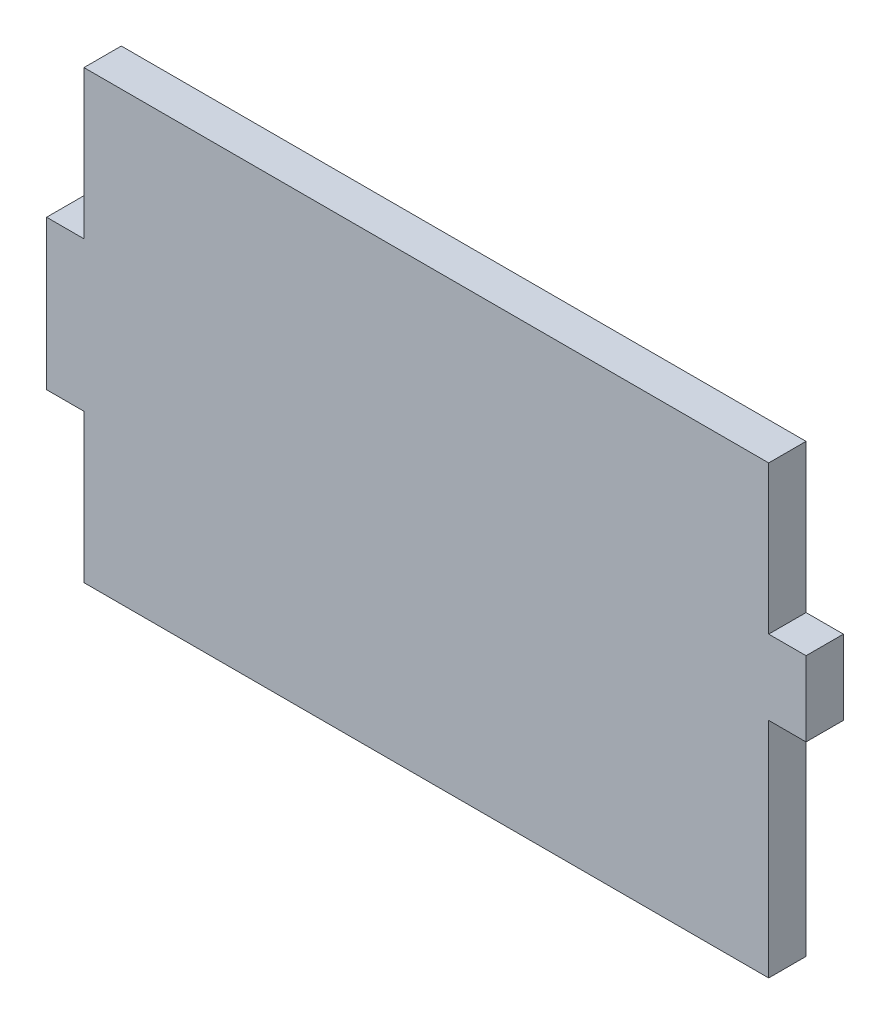
ISO-10303-21;
HEADER;
FILE_DESCRIPTION(('STEP AP214'),'2;1');
FILE_NAME('part.step','',(''),(''),'','','');
FILE_SCHEMA(('AUTOMOTIVE_DESIGN { 1 0 10303 214 1 1 1 1 }'));
ENDSEC;
DATA;
#1=APPLICATION_CONTEXT('core data for automotive mechanical design processes');
#2=APPLICATION_PROTOCOL_DEFINITION('international standard','automotive_design',2000,#1);
#3=PRODUCT_CONTEXT('',#1,'mechanical');
#4=PRODUCT('Part','Part','',(#3));
#5=PRODUCT_RELATED_PRODUCT_CATEGORY('part','',(#4));
#6=PRODUCT_DEFINITION_FORMATION('','',#4);
#7=PRODUCT_DEFINITION_CONTEXT('part definition',#1,'design');
#8=PRODUCT_DEFINITION('design','',#6,#7);
#9=PRODUCT_DEFINITION_SHAPE('','',#8);
#10=(LENGTH_UNIT() NAMED_UNIT(*) SI_UNIT(.MILLI.,.METRE.));
#11=(NAMED_UNIT(*) PLANE_ANGLE_UNIT() SI_UNIT($,.RADIAN.));
#12=(NAMED_UNIT(*) SI_UNIT($,.STERADIAN.) SOLID_ANGLE_UNIT());
#13=UNCERTAINTY_MEASURE_WITH_UNIT(LENGTH_MEASURE(1.E-05),#10,'distance_accuracy_value','');
#14=(GEOMETRIC_REPRESENTATION_CONTEXT(3) GLOBAL_UNCERTAINTY_ASSIGNED_CONTEXT((#13)) GLOBAL_UNIT_ASSIGNED_CONTEXT((#10,
#11,#12)) REPRESENTATION_CONTEXT('',''));
#15=CARTESIAN_POINT('',(0.,0.,0.));
#16=DIRECTION('',(0.,0.,1.));
#17=DIRECTION('',(1.,0.,0.));
#18=AXIS2_PLACEMENT_3D('',#15,#16,#17);
#19=CARTESIAN_POINT('',(0.,0.,3.));
#20=DIRECTION('',(1.,0.,0.));
#21=DIRECTION('',(0.,1.,0.));
#22=AXIS2_PLACEMENT_3D('',#19,#20,#21);
#23=PLANE('',#22);
#24=DIRECTION('',(0.,-1.,0.));
#25=VECTOR('',#24,1.);
#26=CARTESIAN_POINT('',(0.,0.,0.));
#27=LINE('',#26,#25);
#28=CARTESIAN_POINT('',(0.,0.,0.));
#29=VERTEX_POINT('',#28);
#30=CARTESIAN_POINT('',(0.,-11.91,0.));
#31=VERTEX_POINT('',#30);
#32=EDGE_CURVE('E159',#29,#31,#27,.T.);
#33=ORIENTED_EDGE('',*,*,#32,.T.);
#34=DIRECTION('',(0.,0.,-1.));
#35=VECTOR('',#34,1.);
#36=CARTESIAN_POINT('',(0.,-11.91,3.));
#37=LINE('',#36,#35);
#38=CARTESIAN_POINT('',(0.,-11.91,3.));
#39=VERTEX_POINT('',#38);
#40=EDGE_CURVE('E11',#39,#31,#37,.T.);
#41=ORIENTED_EDGE('',*,*,#40,.F.);
#42=DIRECTION('',(0.,-1.,0.));
#43=VECTOR('',#42,1.);
#44=CARTESIAN_POINT('',(0.,0.,3.));
#45=LINE('',#44,#43);
#46=CARTESIAN_POINT('',(0.,0.,3.));
#47=VERTEX_POINT('',#46);
#48=EDGE_CURVE('E181',#47,#39,#45,.T.);
#49=ORIENTED_EDGE('',*,*,#48,.F.);
#50=DIRECTION('',(0.,0.,-1.));
#51=VECTOR('',#50,1.);
#52=CARTESIAN_POINT('',(0.,0.,3.));
#53=LINE('',#52,#51);
#54=EDGE_CURVE('E155',#47,#29,#53,.T.);
#55=ORIENTED_EDGE('',*,*,#54,.T.);
#56=EDGE_LOOP('',(#33,#41,#49,#55));
#57=FACE_BOUND('',#56,.T.);
#58=ADVANCED_FACE('F39',(#57),#23,.F.);
#59=CARTESIAN_POINT('',(0.,-11.91,3.));
#60=DIRECTION('',(0.,-1.,0.));
#61=DIRECTION('',(0.,0.,-1.));
#62=AXIS2_PLACEMENT_3D('',#59,#60,#61);
#63=PLANE('',#62);
#64=DIRECTION('',(-1.,0.,0.));
#65=VECTOR('',#64,1.);
#66=CARTESIAN_POINT('',(0.,-11.91,0.));
#67=LINE('',#66,#65);
#68=CARTESIAN_POINT('',(-2.99999999999999,-11.91,0.));
#69=VERTEX_POINT('',#68);
#70=EDGE_CURVE('E162',#31,#69,#67,.T.);
#71=ORIENTED_EDGE('',*,*,#70,.T.);
#72=DIRECTION('',(0.,0.,-1.));
#73=VECTOR('',#72,1.);
#74=CARTESIAN_POINT('',(-2.99999999999999,-11.91,3.));
#75=LINE('',#74,#73);
#76=CARTESIAN_POINT('',(-2.99999999999999,-11.91,3.));
#77=VERTEX_POINT('',#76);
#78=EDGE_CURVE('E47',#77,#69,#75,.T.);
#79=ORIENTED_EDGE('',*,*,#78,.F.);
#80=DIRECTION('',(-1.,0.,0.));
#81=VECTOR('',#80,1.);
#82=CARTESIAN_POINT('',(0.,-11.91,3.));
#83=LINE('',#82,#81);
#84=EDGE_CURVE('E110',#39,#77,#83,.T.);
#85=ORIENTED_EDGE('',*,*,#84,.F.);
#86=ORIENTED_EDGE('',*,*,#40,.T.);
#87=EDGE_LOOP('',(#71,#79,#85,#86));
#88=FACE_BOUND('',#87,.T.);
#89=ADVANCED_FACE('F259',(#88),#63,.F.);
#90=CARTESIAN_POINT('',(-2.99999999999999,-11.91,3.));
#91=DIRECTION('',(1.,0.,0.));
#92=DIRECTION('',(0.,1.,0.));
#93=AXIS2_PLACEMENT_3D('',#90,#91,#92);
#94=PLANE('',#93);
#95=DIRECTION('',(0.,-1.,0.));
#96=VECTOR('',#95,1.);
#97=CARTESIAN_POINT('',(-2.99999999999999,-11.91,0.));
#98=LINE('',#97,#96);
#99=CARTESIAN_POINT('',(-2.99999999999999,-23.91,0.));
#100=VERTEX_POINT('',#99);
#101=EDGE_CURVE('E164',#69,#100,#98,.T.);
#102=ORIENTED_EDGE('',*,*,#101,.T.);
#103=DIRECTION('',(0.,0.,-1.));
#104=VECTOR('',#103,1.);
#105=CARTESIAN_POINT('',(-2.99999999999999,-23.91,3.));
#106=LINE('',#105,#104);
#107=CARTESIAN_POINT('',(-2.99999999999999,-23.91,3.));
#108=VERTEX_POINT('',#107);
#109=EDGE_CURVE('E200',#108,#100,#106,.T.);
#110=ORIENTED_EDGE('',*,*,#109,.F.);
#111=DIRECTION('',(0.,-1.,0.));
#112=VECTOR('',#111,1.);
#113=CARTESIAN_POINT('',(-2.99999999999999,-11.91,3.));
#114=LINE('',#113,#112);
#115=EDGE_CURVE('E208',#77,#108,#114,.T.);
#116=ORIENTED_EDGE('',*,*,#115,.F.);
#117=ORIENTED_EDGE('',*,*,#78,.T.);
#118=EDGE_LOOP('',(#102,#110,#116,#117));
#119=FACE_BOUND('',#118,.T.);
#120=ADVANCED_FACE('F206',(#119),#94,.F.);
#121=CARTESIAN_POINT('',(0.,-23.91,3.));
#122=DIRECTION('',(0.,1.,0.));
#123=DIRECTION('',(0.,0.,1.));
#124=AXIS2_PLACEMENT_3D('',#121,#122,#123);
#125=PLANE('',#124);
#126=DIRECTION('',(1.,0.,0.));
#127=VECTOR('',#126,1.);
#128=CARTESIAN_POINT('',(0.,-23.91,0.));
#129=LINE('',#128,#127);
#130=CARTESIAN_POINT('',(0.,-23.91,0.));
#131=VERTEX_POINT('',#130);
#132=EDGE_CURVE('E166',#100,#131,#129,.T.);
#133=ORIENTED_EDGE('',*,*,#132,.T.);
#134=DIRECTION('',(0.,0.,-1.));
#135=VECTOR('',#134,1.);
#136=CARTESIAN_POINT('',(0.,-23.91,3.));
#137=LINE('',#136,#135);
#138=CARTESIAN_POINT('',(0.,-23.91,3.));
#139=VERTEX_POINT('',#138);
#140=EDGE_CURVE('E197',#139,#131,#137,.T.);
#141=ORIENTED_EDGE('',*,*,#140,.F.);
#142=DIRECTION('',(1.,0.,0.));
#143=VECTOR('',#142,1.);
#144=CARTESIAN_POINT('',(0.,-23.91,3.));
#145=LINE('',#144,#143);
#146=EDGE_CURVE('E226',#108,#139,#145,.T.);
#147=ORIENTED_EDGE('',*,*,#146,.F.);
#148=ORIENTED_EDGE('',*,*,#109,.T.);
#149=EDGE_LOOP('',(#133,#141,#147,#148));
#150=FACE_BOUND('',#149,.T.);
#151=ADVANCED_FACE('F217',(#150),#125,.F.);
#152=CARTESIAN_POINT('',(0.,-23.91,3.));
#153=DIRECTION('',(1.,0.,0.));
#154=DIRECTION('',(0.,1.,0.));
#155=AXIS2_PLACEMENT_3D('',#152,#153,#154);
#156=PLANE('',#155);
#157=DIRECTION('',(0.,-1.,0.));
#158=VECTOR('',#157,1.);
#159=CARTESIAN_POINT('',(0.,-23.91,0.));
#160=LINE('',#159,#158);
#161=CARTESIAN_POINT('',(0.,-35.83,0.));
#162=VERTEX_POINT('',#161);
#163=EDGE_CURVE('E168',#131,#162,#160,.T.);
#164=ORIENTED_EDGE('',*,*,#163,.T.);
#165=DIRECTION('',(0.,0.,-1.));
#166=VECTOR('',#165,1.);
#167=CARTESIAN_POINT('',(0.,-35.83,3.));
#168=LINE('',#167,#166);
#169=CARTESIAN_POINT('',(0.,-35.83,3.));
#170=VERTEX_POINT('',#169);
#171=EDGE_CURVE('E194',#170,#162,#168,.T.);
#172=ORIENTED_EDGE('',*,*,#171,.F.);
#173=DIRECTION('',(0.,-1.,0.));
#174=VECTOR('',#173,1.);
#175=CARTESIAN_POINT('',(0.,-23.91,3.));
#176=LINE('',#175,#174);
#177=EDGE_CURVE('E223',#139,#170,#176,.T.);
#178=ORIENTED_EDGE('',*,*,#177,.F.);
#179=ORIENTED_EDGE('',*,*,#140,.T.);
#180=EDGE_LOOP('',(#164,#172,#178,#179));
#181=FACE_BOUND('',#180,.T.);
#182=ADVANCED_FACE('F221',(#181),#156,.F.);
#183=CARTESIAN_POINT('',(0.,-35.83,3.));
#184=DIRECTION('',(0.,1.,0.));
#185=DIRECTION('',(0.,0.,1.));
#186=AXIS2_PLACEMENT_3D('',#183,#184,#185);
#187=PLANE('',#186);
#188=DIRECTION('',(1.,0.,0.));
#189=VECTOR('',#188,1.);
#190=CARTESIAN_POINT('',(0.,-35.83,0.));
#191=LINE('',#190,#189);
#192=CARTESIAN_POINT('',(55.,-35.83,0.));
#193=VERTEX_POINT('',#192);
#194=EDGE_CURVE('E170',#162,#193,#191,.T.);
#195=ORIENTED_EDGE('',*,*,#194,.T.);
#196=DIRECTION('',(0.,0.,-1.));
#197=VECTOR('',#196,1.);
#198=CARTESIAN_POINT('',(55.,-35.83,3.));
#199=LINE('',#198,#197);
#200=CARTESIAN_POINT('',(55.,-35.83,3.));
#201=VERTEX_POINT('',#200);
#202=EDGE_CURVE('E191',#201,#193,#199,.T.);
#203=ORIENTED_EDGE('',*,*,#202,.F.);
#204=DIRECTION('',(1.,0.,0.));
#205=VECTOR('',#204,1.);
#206=CARTESIAN_POINT('',(0.,-35.83,3.));
#207=LINE('',#206,#205);
#208=EDGE_CURVE('E225',#170,#201,#207,.T.);
#209=ORIENTED_EDGE('',*,*,#208,.F.);
#210=ORIENTED_EDGE('',*,*,#171,.T.);
#211=EDGE_LOOP('',(#195,#203,#209,#210));
#212=FACE_BOUND('',#211,.T.);
#213=ADVANCED_FACE('F272',(#212),#187,.F.);
#214=CARTESIAN_POINT('',(55.,-17.91,3.));
#215=DIRECTION('',(-1.,0.,0.));
#216=DIRECTION('',(0.,-1.,0.));
#217=AXIS2_PLACEMENT_3D('',#214,#215,#216);
#218=PLANE('',#217);
#219=DIRECTION('',(0.,1.,0.));
#220=VECTOR('',#219,1.);
#221=CARTESIAN_POINT('',(55.,-17.91,0.));
#222=LINE('',#221,#220);
#223=CARTESIAN_POINT('',(55.,-17.91,0.));
#224=VERTEX_POINT('',#223);
#225=EDGE_CURVE('E172',#193,#224,#222,.T.);
#226=ORIENTED_EDGE('',*,*,#225,.T.);
#227=DIRECTION('',(0.,0.,-1.));
#228=VECTOR('',#227,1.);
#229=CARTESIAN_POINT('',(55.,-17.91,3.));
#230=LINE('',#229,#228);
#231=CARTESIAN_POINT('',(55.,-17.91,3.));
#232=VERTEX_POINT('',#231);
#233=EDGE_CURVE('E188',#232,#224,#230,.T.);
#234=ORIENTED_EDGE('',*,*,#233,.F.);
#235=DIRECTION('',(0.,1.,0.));
#236=VECTOR('',#235,1.);
#237=CARTESIAN_POINT('',(55.,-17.91,3.));
#238=LINE('',#237,#236);
#239=EDGE_CURVE('E228',#201,#232,#238,.T.);
#240=ORIENTED_EDGE('',*,*,#239,.F.);
#241=ORIENTED_EDGE('',*,*,#202,.T.);
#242=EDGE_LOOP('',(#226,#234,#240,#241));
#243=FACE_BOUND('',#242,.T.);
#244=ADVANCED_FACE('F275',(#243),#218,.F.);
#245=CARTESIAN_POINT('',(55.,-17.91,3.));
#246=DIRECTION('',(0.,1.,0.));
#247=DIRECTION('',(-1.,0.,0.));
#248=AXIS2_PLACEMENT_3D('',#245,#246,#247);
#249=PLANE('',#248);
#250=DIRECTION('',(1.,0.,0.));
#251=VECTOR('',#250,1.);
#252=CARTESIAN_POINT('',(55.,-17.91,0.));
#253=LINE('',#252,#251);
#254=CARTESIAN_POINT('',(58.,-17.91,0.));
#255=VERTEX_POINT('',#254);
#256=EDGE_CURVE('E174',#224,#255,#253,.T.);
#257=ORIENTED_EDGE('',*,*,#256,.T.);
#258=DIRECTION('',(0.,0.,-1.));
#259=VECTOR('',#258,1.);
#260=CARTESIAN_POINT('',(58.,-17.91,3.));
#261=LINE('',#260,#259);
#262=CARTESIAN_POINT('',(58.,-17.91,3.));
#263=VERTEX_POINT('',#262);
#264=EDGE_CURVE('E185',#263,#255,#261,.T.);
#265=ORIENTED_EDGE('',*,*,#264,.F.);
#266=DIRECTION('',(1.,0.,0.));
#267=VECTOR('',#266,1.);
#268=CARTESIAN_POINT('',(55.,-17.91,3.));
#269=LINE('',#268,#267);
#270=EDGE_CURVE('E234',#232,#263,#269,.T.);
#271=ORIENTED_EDGE('',*,*,#270,.F.);
#272=ORIENTED_EDGE('',*,*,#233,.T.);
#273=EDGE_LOOP('',(#257,#265,#271,#272));
#274=FACE_BOUND('',#273,.T.);
#275=ADVANCED_FACE('F240',(#274),#249,.F.);
#276=CARTESIAN_POINT('',(58.,-11.91,3.));
#277=DIRECTION('',(-1.,0.,0.));
#278=DIRECTION('',(0.,-1.,0.));
#279=AXIS2_PLACEMENT_3D('',#276,#277,#278);
#280=PLANE('',#279);
#281=DIRECTION('',(0.,1.,0.));
#282=VECTOR('',#281,1.);
#283=CARTESIAN_POINT('',(58.,-11.91,0.));
#284=LINE('',#283,#282);
#285=CARTESIAN_POINT('',(58.,-11.91,0.));
#286=VERTEX_POINT('',#285);
#287=EDGE_CURVE('E176',#255,#286,#284,.T.);
#288=ORIENTED_EDGE('',*,*,#287,.T.);
#289=DIRECTION('',(0.,0.,-1.));
#290=VECTOR('',#289,1.);
#291=CARTESIAN_POINT('',(58.,-11.91,3.));
#292=LINE('',#291,#290);
#293=CARTESIAN_POINT('',(58.,-11.91,3.));
#294=VERTEX_POINT('',#293);
#295=EDGE_CURVE('E150',#294,#286,#292,.T.);
#296=ORIENTED_EDGE('',*,*,#295,.F.);
#297=DIRECTION('',(0.,1.,0.));
#298=VECTOR('',#297,1.);
#299=CARTESIAN_POINT('',(58.,-11.91,3.));
#300=LINE('',#299,#298);
#301=EDGE_CURVE('E141',#263,#294,#300,.T.);
#302=ORIENTED_EDGE('',*,*,#301,.F.);
#303=ORIENTED_EDGE('',*,*,#264,.T.);
#304=EDGE_LOOP('',(#288,#296,#302,#303));
#305=FACE_BOUND('',#304,.T.);
#306=ADVANCED_FACE('F244',(#305),#280,.F.);
#307=CARTESIAN_POINT('',(55.,-11.91,3.));
#308=DIRECTION('',(0.,-1.,0.));
#309=DIRECTION('',(0.,0.,-1.));
#310=AXIS2_PLACEMENT_3D('',#307,#308,#309);
#311=PLANE('',#310);
#312=DIRECTION('',(-1.,0.,0.));
#313=VECTOR('',#312,1.);
#314=CARTESIAN_POINT('',(55.,-11.91,0.));
#315=LINE('',#314,#313);
#316=CARTESIAN_POINT('',(55.,-11.91,0.));
#317=VERTEX_POINT('',#316);
#318=EDGE_CURVE('E149',#286,#317,#315,.T.);
#319=ORIENTED_EDGE('',*,*,#318,.T.);
#320=DIRECTION('',(0.,0.,-1.));
#321=VECTOR('',#320,1.);
#322=CARTESIAN_POINT('',(55.,-11.91,3.));
#323=LINE('',#322,#321);
#324=CARTESIAN_POINT('',(55.,-11.91,3.));
#325=VERTEX_POINT('',#324);
#326=EDGE_CURVE('E146',#325,#317,#323,.T.);
#327=ORIENTED_EDGE('',*,*,#326,.F.);
#328=DIRECTION('',(-1.,0.,0.));
#329=VECTOR('',#328,1.);
#330=CARTESIAN_POINT('',(55.,-11.91,3.));
#331=LINE('',#330,#329);
#332=EDGE_CURVE('E135',#294,#325,#331,.T.);
#333=ORIENTED_EDGE('',*,*,#332,.F.);
#334=ORIENTED_EDGE('',*,*,#295,.T.);
#335=EDGE_LOOP('',(#319,#327,#333,#334));
#336=FACE_BOUND('',#335,.T.);
#337=ADVANCED_FACE('F147',(#336),#311,.F.);
#338=CARTESIAN_POINT('',(55.,0.,3.));
#339=DIRECTION('',(-1.,0.,0.));
#340=DIRECTION('',(0.,-1.,0.));
#341=AXIS2_PLACEMENT_3D('',#338,#339,#340);
#342=PLANE('',#341);
#343=DIRECTION('',(0.,1.,0.));
#344=VECTOR('',#343,1.);
#345=CARTESIAN_POINT('',(55.,0.,0.));
#346=LINE('',#345,#344);
#347=CARTESIAN_POINT('',(55.,0.,0.));
#348=VERTEX_POINT('',#347);
#349=EDGE_CURVE('E96',#317,#348,#346,.T.);
#350=ORIENTED_EDGE('',*,*,#349,.T.);
#351=DIRECTION('',(0.,0.,-1.));
#352=VECTOR('',#351,1.);
#353=CARTESIAN_POINT('',(55.,0.,3.));
#354=LINE('',#353,#352);
#355=CARTESIAN_POINT('',(55.,0.,3.));
#356=VERTEX_POINT('',#355);
#357=EDGE_CURVE('E151',#356,#348,#354,.T.);
#358=ORIENTED_EDGE('',*,*,#357,.F.);
#359=DIRECTION('',(0.,1.,0.));
#360=VECTOR('',#359,1.);
#361=CARTESIAN_POINT('',(55.,0.,3.));
#362=LINE('',#361,#360);
#363=EDGE_CURVE('E139',#325,#356,#362,.T.);
#364=ORIENTED_EDGE('',*,*,#363,.F.);
#365=ORIENTED_EDGE('',*,*,#326,.T.);
#366=EDGE_LOOP('',(#350,#358,#364,#365));
#367=FACE_BOUND('',#366,.T.);
#368=ADVANCED_FACE('F153',(#367),#342,.F.);
#369=CARTESIAN_POINT('',(0.,0.,3.));
#370=DIRECTION('',(0.,-1.,0.));
#371=DIRECTION('',(0.,0.,-1.));
#372=AXIS2_PLACEMENT_3D('',#369,#370,#371);
#373=PLANE('',#372);
#374=DIRECTION('',(-1.,0.,0.));
#375=VECTOR('',#374,1.);
#376=CARTESIAN_POINT('',(0.,0.,0.));
#377=LINE('',#376,#375);
#378=EDGE_CURVE('E102',#348,#29,#377,.T.);
#379=ORIENTED_EDGE('',*,*,#378,.T.);
#380=ORIENTED_EDGE('',*,*,#54,.F.);
#381=DIRECTION('',(-1.,0.,0.));
#382=VECTOR('',#381,1.);
#383=CARTESIAN_POINT('',(0.,0.,3.));
#384=LINE('',#383,#382);
#385=EDGE_CURVE('E55',#356,#47,#384,.T.);
#386=ORIENTED_EDGE('',*,*,#385,.F.);
#387=ORIENTED_EDGE('',*,*,#357,.T.);
#388=EDGE_LOOP('',(#379,#380,#386,#387));
#389=FACE_BOUND('',#388,.T.);
#390=ADVANCED_FACE('F248',(#389),#373,.F.);
#391=CARTESIAN_POINT('',(0.,0.,3.));
#392=DIRECTION('',(0.,0.,-1.));
#393=DIRECTION('',(-1.,0.,0.));
#394=AXIS2_PLACEMENT_3D('',#391,#392,#393);
#395=PLANE('',#394);
#396=ORIENTED_EDGE('',*,*,#48,.T.);
#397=ORIENTED_EDGE('',*,*,#84,.T.);
#398=ORIENTED_EDGE('',*,*,#115,.T.);
#399=ORIENTED_EDGE('',*,*,#146,.T.);
#400=ORIENTED_EDGE('',*,*,#177,.T.);
#401=ORIENTED_EDGE('',*,*,#208,.T.);
#402=ORIENTED_EDGE('',*,*,#239,.T.);
#403=ORIENTED_EDGE('',*,*,#270,.T.);
#404=ORIENTED_EDGE('',*,*,#301,.T.);
#405=ORIENTED_EDGE('',*,*,#332,.T.);
#406=ORIENTED_EDGE('',*,*,#363,.T.);
#407=ORIENTED_EDGE('',*,*,#385,.T.);
#408=EDGE_LOOP('',(#396,#397,#398,#399,#400,#401,#402,#403,#404,#405,#406,#407));
#409=FACE_BOUND('',#408,.T.);
#410=ADVANCED_FACE('F137',(#409),#395,.F.);
#411=CARTESIAN_POINT('',(0.,0.,0.));
#412=DIRECTION('',(0.,0.,-1.));
#413=DIRECTION('',(-1.,0.,0.));
#414=AXIS2_PLACEMENT_3D('',#411,#412,#413);
#415=PLANE('',#414);
#416=ORIENTED_EDGE('',*,*,#32,.F.);
#417=ORIENTED_EDGE('',*,*,#378,.F.);
#418=ORIENTED_EDGE('',*,*,#349,.F.);
#419=ORIENTED_EDGE('',*,*,#318,.F.);
#420=ORIENTED_EDGE('',*,*,#287,.F.);
#421=ORIENTED_EDGE('',*,*,#256,.F.);
#422=ORIENTED_EDGE('',*,*,#225,.F.);
#423=ORIENTED_EDGE('',*,*,#194,.F.);
#424=ORIENTED_EDGE('',*,*,#163,.F.);
#425=ORIENTED_EDGE('',*,*,#132,.F.);
#426=ORIENTED_EDGE('',*,*,#101,.F.);
#427=ORIENTED_EDGE('',*,*,#70,.F.);
#428=EDGE_LOOP('',(#416,#417,#418,#419,#420,#421,#422,#423,#424,#425,#426,#427));
#429=FACE_BOUND('',#428,.T.);
#430=ADVANCED_FACE('F212',(#429),#415,.T.);
#431=CLOSED_SHELL('',(#58,#89,#120,#151,#182,#213,#244,#275,#306,#337,#368,#390,#410,#430));
#432=MANIFOLD_SOLID_BREP('B2',#431);
#433=ADVANCED_BREP_SHAPE_REPRESENTATION('',(#18,#432),#14);
#434=SHAPE_DEFINITION_REPRESENTATION(#9,#433);
ENDSEC;
END-ISO-10303-21;
